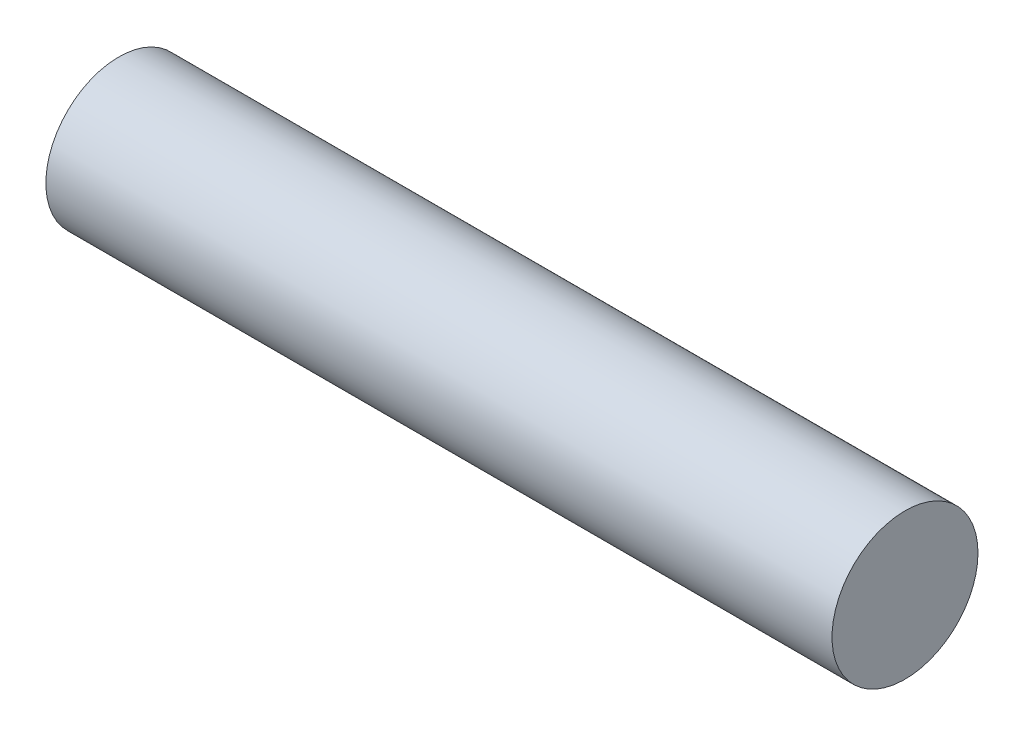
ISO-10303-21;
HEADER;
FILE_DESCRIPTION(('STEP AP214'),'2;1');
FILE_NAME('part.step','',(''),(''),'','','');
FILE_SCHEMA(('AUTOMOTIVE_DESIGN { 1 0 10303 214 1 1 1 1 }'));
ENDSEC;
DATA;
#1=APPLICATION_CONTEXT('core data for automotive mechanical design processes');
#2=APPLICATION_PROTOCOL_DEFINITION('international standard','automotive_design',2000,#1);
#3=PRODUCT_CONTEXT('',#1,'mechanical');
#4=PRODUCT('Part','Part','',(#3));
#5=PRODUCT_RELATED_PRODUCT_CATEGORY('part','',(#4));
#6=PRODUCT_DEFINITION_FORMATION('','',#4);
#7=PRODUCT_DEFINITION_CONTEXT('part definition',#1,'design');
#8=PRODUCT_DEFINITION('design','',#6,#7);
#9=PRODUCT_DEFINITION_SHAPE('','',#8);
#10=(LENGTH_UNIT() NAMED_UNIT(*) SI_UNIT(.MILLI.,.METRE.));
#11=(NAMED_UNIT(*) PLANE_ANGLE_UNIT() SI_UNIT($,.RADIAN.));
#12=(NAMED_UNIT(*) SI_UNIT($,.STERADIAN.) SOLID_ANGLE_UNIT());
#13=UNCERTAINTY_MEASURE_WITH_UNIT(LENGTH_MEASURE(1.E-05),#10,'distance_accuracy_value','');
#14=(GEOMETRIC_REPRESENTATION_CONTEXT(3) GLOBAL_UNCERTAINTY_ASSIGNED_CONTEXT((#13)) GLOBAL_UNIT_ASSIGNED_CONTEXT((#10,
#11,#12)) REPRESENTATION_CONTEXT('',''));
#15=CARTESIAN_POINT('',(0.,0.,0.));
#16=DIRECTION('',(0.,0.,1.));
#17=DIRECTION('',(1.,0.,0.));
#18=AXIS2_PLACEMENT_3D('',#15,#16,#17);
#19=CARTESIAN_POINT('',(476.85,0.,0.));
#20=DIRECTION('',(-1.,0.,0.));
#21=DIRECTION('',(0.,0.,1.));
#22=AXIS2_PLACEMENT_3D('',#19,#20,#21);
#23=CYLINDRICAL_SURFACE('',#22,44.27);
#24=CARTESIAN_POINT('',(476.85,0.,0.));
#25=DIRECTION('',(1.,0.,0.));
#26=DIRECTION('',(0.,0.,-1.));
#27=AXIS2_PLACEMENT_3D('',#24,#25,#26);
#28=CIRCLE('',#27,44.27);
#29=CARTESIAN_POINT('',(476.85,0.,-44.27));
#30=VERTEX_POINT('',#29);
#31=EDGE_CURVE('E10',#30,#30,#28,.T.);
#32=ORIENTED_EDGE('',*,*,#31,.F.);
#33=EDGE_LOOP('',(#32));
#34=FACE_BOUND('',#33,.T.);
#35=CARTESIAN_POINT('',(0.,0.,0.));
#36=DIRECTION('',(1.,0.,0.));
#37=DIRECTION('',(0.,0.,-1.));
#38=AXIS2_PLACEMENT_3D('',#35,#36,#37);
#39=CIRCLE('',#38,44.27);
#40=CARTESIAN_POINT('',(0.,0.,-44.27));
#41=VERTEX_POINT('',#40);
#42=EDGE_CURVE('E37',#41,#41,#39,.T.);
#43=ORIENTED_EDGE('',*,*,#42,.T.);
#44=EDGE_LOOP('',(#43));
#45=FACE_BOUND('',#44,.T.);
#46=ADVANCED_FACE('F34',(#34,#45),#23,.T.);
#47=CARTESIAN_POINT('',(476.85,0.,0.));
#48=DIRECTION('',(1.,0.,0.));
#49=DIRECTION('',(0.,0.,-1.));
#50=AXIS2_PLACEMENT_3D('',#47,#48,#49);
#51=PLANE('',#50);
#52=ORIENTED_EDGE('',*,*,#31,.T.);
#53=EDGE_LOOP('',(#52));
#54=FACE_BOUND('',#53,.T.);
#55=ADVANCED_FACE('F49',(#54),#51,.T.);
#56=CARTESIAN_POINT('',(0.,0.,0.));
#57=DIRECTION('',(1.,0.,0.));
#58=DIRECTION('',(0.,0.,-1.));
#59=AXIS2_PLACEMENT_3D('',#56,#57,#58);
#60=PLANE('',#59);
#61=ORIENTED_EDGE('',*,*,#42,.F.);
#62=EDGE_LOOP('',(#61));
#63=FACE_BOUND('',#62,.T.);
#64=ADVANCED_FACE('F47',(#63),#60,.F.);
#65=CLOSED_SHELL('',(#46,#55,#64));
#66=MANIFOLD_SOLID_BREP('B2',#65);
#67=ADVANCED_BREP_SHAPE_REPRESENTATION('',(#18,#66),#14);
#68=SHAPE_DEFINITION_REPRESENTATION(#9,#67);
ENDSEC;
END-ISO-10303-21;
